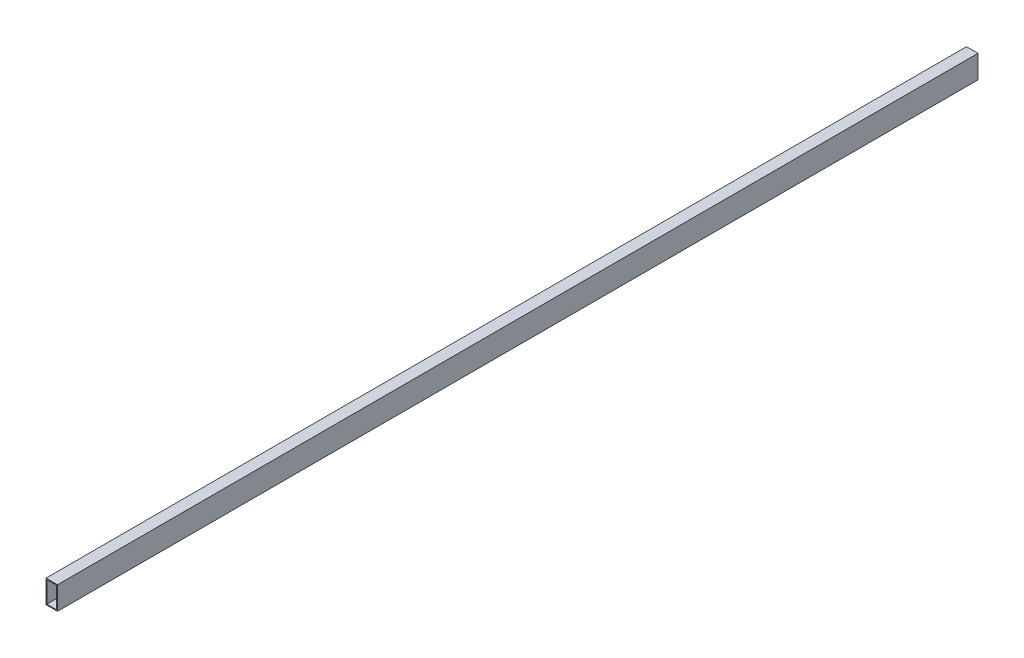
ISO-10303-21;
HEADER;
FILE_DESCRIPTION(('STEP AP214'),'2;1');
FILE_NAME('part.step','',(''),(''),'','','');
FILE_SCHEMA(('AUTOMOTIVE_DESIGN { 1 0 10303 214 1 1 1 1 }'));
ENDSEC;
DATA;
#1=APPLICATION_CONTEXT('core data for automotive mechanical design processes');
#2=APPLICATION_PROTOCOL_DEFINITION('international standard','automotive_design',2000,#1);
#3=PRODUCT_CONTEXT('',#1,'mechanical');
#4=PRODUCT('Part','Part','',(#3));
#5=PRODUCT_RELATED_PRODUCT_CATEGORY('part','',(#4));
#6=PRODUCT_DEFINITION_FORMATION('','',#4);
#7=PRODUCT_DEFINITION_CONTEXT('part definition',#1,'design');
#8=PRODUCT_DEFINITION('design','',#6,#7);
#9=PRODUCT_DEFINITION_SHAPE('','',#8);
#10=(LENGTH_UNIT() NAMED_UNIT(*) SI_UNIT(.MILLI.,.METRE.));
#11=(NAMED_UNIT(*) PLANE_ANGLE_UNIT() SI_UNIT($,.RADIAN.));
#12=(NAMED_UNIT(*) SI_UNIT($,.STERADIAN.) SOLID_ANGLE_UNIT());
#13=UNCERTAINTY_MEASURE_WITH_UNIT(LENGTH_MEASURE(1.E-05),#10,'distance_accuracy_value','');
#14=(GEOMETRIC_REPRESENTATION_CONTEXT(3) GLOBAL_UNCERTAINTY_ASSIGNED_CONTEXT((#13)) GLOBAL_UNIT_ASSIGNED_CONTEXT((#10,
#11,#12)) REPRESENTATION_CONTEXT('',''));
#15=CARTESIAN_POINT('',(0.,0.,0.));
#16=DIRECTION('',(0.,0.,1.));
#17=DIRECTION('',(1.,0.,0.));
#18=AXIS2_PLACEMENT_3D('',#15,#16,#17);
#19=CARTESIAN_POINT('',(0.,0.,4000.));
#20=DIRECTION('',(0.,0.,1.));
#21=DIRECTION('',(1.,0.,0.));
#22=AXIS2_PLACEMENT_3D('',#19,#20,#21);
#23=PLANE('',#22);
#24=DIRECTION('',(0.,-1.,0.));
#25=VECTOR('',#24,1.);
#26=CARTESIAN_POINT('',(-25.,-50.,4000.));
#27=LINE('',#26,#25);
#28=CARTESIAN_POINT('',(-25.,50.,4000.));
#29=VERTEX_POINT('',#28);
#30=CARTESIAN_POINT('',(-25.,-50.,4000.));
#31=VERTEX_POINT('',#30);
#32=EDGE_CURVE('E134',#29,#31,#27,.T.);
#33=ORIENTED_EDGE('',*,*,#32,.T.);
#34=DIRECTION('',(1.,0.,0.));
#35=VECTOR('',#34,1.);
#36=CARTESIAN_POINT('',(25.,-50.,4000.));
#37=LINE('',#36,#35);
#38=CARTESIAN_POINT('',(25.,-50.,4000.));
#39=VERTEX_POINT('',#38);
#40=EDGE_CURVE('E137',#31,#39,#37,.T.);
#41=ORIENTED_EDGE('',*,*,#40,.T.);
#42=DIRECTION('',(0.,1.,0.));
#43=VECTOR('',#42,1.);
#44=CARTESIAN_POINT('',(25.,-50.,4000.));
#45=LINE('',#44,#43);
#46=CARTESIAN_POINT('',(25.,50.,4000.));
#47=VERTEX_POINT('',#46);
#48=EDGE_CURVE('E140',#39,#47,#45,.T.);
#49=ORIENTED_EDGE('',*,*,#48,.T.);
#50=DIRECTION('',(-1.,0.,0.));
#51=VECTOR('',#50,1.);
#52=CARTESIAN_POINT('',(25.,50.,4000.));
#53=LINE('',#52,#51);
#54=EDGE_CURVE('E142',#47,#29,#53,.T.);
#55=ORIENTED_EDGE('',*,*,#54,.T.);
#56=EDGE_LOOP('',(#33,#41,#49,#55));
#57=FACE_BOUND('',#56,.T.);
#58=DIRECTION('',(-1.,0.,0.));
#59=VECTOR('',#58,1.);
#60=CARTESIAN_POINT('',(21.,46.,4000.));
#61=LINE('',#60,#59);
#62=CARTESIAN_POINT('',(21.,46.,4000.));
#63=VERTEX_POINT('',#62);
#64=CARTESIAN_POINT('',(-21.,46.,4000.));
#65=VERTEX_POINT('',#64);
#66=EDGE_CURVE('E106',#63,#65,#61,.T.);
#67=ORIENTED_EDGE('',*,*,#66,.F.);
#68=DIRECTION('',(0.,1.,0.));
#69=VECTOR('',#68,1.);
#70=CARTESIAN_POINT('',(21.,-46.,4000.));
#71=LINE('',#70,#69);
#72=CARTESIAN_POINT('',(21.,-46.,4000.));
#73=VERTEX_POINT('',#72);
#74=EDGE_CURVE('E98',#73,#63,#71,.T.);
#75=ORIENTED_EDGE('',*,*,#74,.F.);
#76=DIRECTION('',(1.,0.,0.));
#77=VECTOR('',#76,1.);
#78=CARTESIAN_POINT('',(21.,-46.,4000.));
#79=LINE('',#78,#77);
#80=CARTESIAN_POINT('',(-21.,-46.,4000.));
#81=VERTEX_POINT('',#80);
#82=EDGE_CURVE('E120',#81,#73,#79,.T.);
#83=ORIENTED_EDGE('',*,*,#82,.F.);
#84=DIRECTION('',(0.,-1.,0.));
#85=VECTOR('',#84,1.);
#86=CARTESIAN_POINT('',(-21.,-46.,4000.));
#87=LINE('',#86,#85);
#88=EDGE_CURVE('E118',#65,#81,#87,.T.);
#89=ORIENTED_EDGE('',*,*,#88,.F.);
#90=EDGE_LOOP('',(#67,#75,#83,#89));
#91=FACE_BOUND('',#90,.T.);
#92=ADVANCED_FACE('F33',(#57,#91),#23,.T.);
#93=CARTESIAN_POINT('',(0.,0.,0.));
#94=DIRECTION('',(0.,0.,1.));
#95=DIRECTION('',(1.,0.,0.));
#96=AXIS2_PLACEMENT_3D('',#93,#94,#95);
#97=PLANE('',#96);
#98=DIRECTION('',(0.,-1.,0.));
#99=VECTOR('',#98,1.);
#100=CARTESIAN_POINT('',(-25.,-50.,0.));
#101=LINE('',#100,#99);
#102=CARTESIAN_POINT('',(-25.,50.,0.));
#103=VERTEX_POINT('',#102);
#104=CARTESIAN_POINT('',(-25.,-50.,0.));
#105=VERTEX_POINT('',#104);
#106=EDGE_CURVE('E114',#103,#105,#101,.T.);
#107=ORIENTED_EDGE('',*,*,#106,.F.);
#108=DIRECTION('',(-1.,0.,0.));
#109=VECTOR('',#108,1.);
#110=CARTESIAN_POINT('',(25.,50.,0.));
#111=LINE('',#110,#109);
#112=CARTESIAN_POINT('',(25.,50.,0.));
#113=VERTEX_POINT('',#112);
#114=EDGE_CURVE('E138',#113,#103,#111,.T.);
#115=ORIENTED_EDGE('',*,*,#114,.F.);
#116=DIRECTION('',(0.,1.,0.));
#117=VECTOR('',#116,1.);
#118=CARTESIAN_POINT('',(25.,-50.,0.));
#119=LINE('',#118,#117);
#120=CARTESIAN_POINT('',(25.,-50.,0.));
#121=VERTEX_POINT('',#120);
#122=EDGE_CURVE('E149',#121,#113,#119,.T.);
#123=ORIENTED_EDGE('',*,*,#122,.F.);
#124=DIRECTION('',(1.,0.,0.));
#125=VECTOR('',#124,1.);
#126=CARTESIAN_POINT('',(25.,-50.,0.));
#127=LINE('',#126,#125);
#128=EDGE_CURVE('E147',#105,#121,#127,.T.);
#129=ORIENTED_EDGE('',*,*,#128,.F.);
#130=EDGE_LOOP('',(#107,#115,#123,#129));
#131=FACE_BOUND('',#130,.T.);
#132=DIRECTION('',(0.,1.,0.));
#133=VECTOR('',#132,1.);
#134=CARTESIAN_POINT('',(21.,-46.,0.));
#135=LINE('',#134,#133);
#136=CARTESIAN_POINT('',(21.,-46.,0.));
#137=VERTEX_POINT('',#136);
#138=CARTESIAN_POINT('',(21.,46.,0.));
#139=VERTEX_POINT('',#138);
#140=EDGE_CURVE('E56',#137,#139,#135,.T.);
#141=ORIENTED_EDGE('',*,*,#140,.T.);
#142=DIRECTION('',(-1.,0.,0.));
#143=VECTOR('',#142,1.);
#144=CARTESIAN_POINT('',(21.,46.,0.));
#145=LINE('',#144,#143);
#146=CARTESIAN_POINT('',(-21.,46.,0.));
#147=VERTEX_POINT('',#146);
#148=EDGE_CURVE('E113',#139,#147,#145,.T.);
#149=ORIENTED_EDGE('',*,*,#148,.T.);
#150=DIRECTION('',(0.,-1.,0.));
#151=VECTOR('',#150,1.);
#152=CARTESIAN_POINT('',(-21.,-46.,0.));
#153=LINE('',#152,#151);
#154=CARTESIAN_POINT('',(-21.,-46.,0.));
#155=VERTEX_POINT('',#154);
#156=EDGE_CURVE('E126',#147,#155,#153,.T.);
#157=ORIENTED_EDGE('',*,*,#156,.T.);
#158=DIRECTION('',(1.,0.,0.));
#159=VECTOR('',#158,1.);
#160=CARTESIAN_POINT('',(21.,-46.,0.));
#161=LINE('',#160,#159);
#162=EDGE_CURVE('E107',#155,#137,#161,.T.);
#163=ORIENTED_EDGE('',*,*,#162,.T.);
#164=EDGE_LOOP('',(#141,#149,#157,#163));
#165=FACE_BOUND('',#164,.T.);
#166=ADVANCED_FACE('F167',(#131,#165),#97,.F.);
#167=CARTESIAN_POINT('',(-25.,-50.,4000.));
#168=DIRECTION('',(1.,0.,0.));
#169=DIRECTION('',(0.,0.,-1.));
#170=AXIS2_PLACEMENT_3D('',#167,#168,#169);
#171=PLANE('',#170);
#172=ORIENTED_EDGE('',*,*,#106,.T.);
#173=DIRECTION('',(0.,0.,-1.));
#174=VECTOR('',#173,1.);
#175=CARTESIAN_POINT('',(-25.,-50.,4000.));
#176=LINE('',#175,#174);
#177=EDGE_CURVE('E11',#31,#105,#176,.T.);
#178=ORIENTED_EDGE('',*,*,#177,.F.);
#179=ORIENTED_EDGE('',*,*,#32,.F.);
#180=DIRECTION('',(0.,0.,-1.));
#181=VECTOR('',#180,1.);
#182=CARTESIAN_POINT('',(-25.,50.,4000.));
#183=LINE('',#182,#181);
#184=EDGE_CURVE('E144',#29,#103,#183,.T.);
#185=ORIENTED_EDGE('',*,*,#184,.T.);
#186=EDGE_LOOP('',(#172,#178,#179,#185));
#187=FACE_BOUND('',#186,.T.);
#188=ADVANCED_FACE('F35',(#187),#171,.F.);
#189=CARTESIAN_POINT('',(25.,-50.,4000.));
#190=DIRECTION('',(0.,1.,0.));
#191=DIRECTION('',(0.,0.,1.));
#192=AXIS2_PLACEMENT_3D('',#189,#190,#191);
#193=PLANE('',#192);
#194=ORIENTED_EDGE('',*,*,#128,.T.);
#195=DIRECTION('',(0.,0.,-1.));
#196=VECTOR('',#195,1.);
#197=CARTESIAN_POINT('',(25.,-50.,4000.));
#198=LINE('',#197,#196);
#199=EDGE_CURVE('E41',#39,#121,#198,.T.);
#200=ORIENTED_EDGE('',*,*,#199,.F.);
#201=ORIENTED_EDGE('',*,*,#40,.F.);
#202=ORIENTED_EDGE('',*,*,#177,.T.);
#203=EDGE_LOOP('',(#194,#200,#201,#202));
#204=FACE_BOUND('',#203,.T.);
#205=ADVANCED_FACE('F177',(#204),#193,.F.);
#206=CARTESIAN_POINT('',(25.,-50.,4000.));
#207=DIRECTION('',(-1.,0.,0.));
#208=DIRECTION('',(0.,0.,1.));
#209=AXIS2_PLACEMENT_3D('',#206,#207,#208);
#210=PLANE('',#209);
#211=ORIENTED_EDGE('',*,*,#122,.T.);
#212=DIRECTION('',(0.,0.,-1.));
#213=VECTOR('',#212,1.);
#214=CARTESIAN_POINT('',(25.,50.,4000.));
#215=LINE('',#214,#213);
#216=EDGE_CURVE('E154',#47,#113,#215,.T.);
#217=ORIENTED_EDGE('',*,*,#216,.F.);
#218=ORIENTED_EDGE('',*,*,#48,.F.);
#219=ORIENTED_EDGE('',*,*,#199,.T.);
#220=EDGE_LOOP('',(#211,#217,#218,#219));
#221=FACE_BOUND('',#220,.T.);
#222=ADVANCED_FACE('F161',(#221),#210,.F.);
#223=CARTESIAN_POINT('',(25.,50.,4000.));
#224=DIRECTION('',(0.,-1.,0.));
#225=DIRECTION('',(0.,0.,-1.));
#226=AXIS2_PLACEMENT_3D('',#223,#224,#225);
#227=PLANE('',#226);
#228=ORIENTED_EDGE('',*,*,#114,.T.);
#229=ORIENTED_EDGE('',*,*,#184,.F.);
#230=ORIENTED_EDGE('',*,*,#54,.F.);
#231=ORIENTED_EDGE('',*,*,#216,.T.);
#232=EDGE_LOOP('',(#228,#229,#230,#231));
#233=FACE_BOUND('',#232,.T.);
#234=ADVANCED_FACE('F171',(#233),#227,.F.);
#235=CARTESIAN_POINT('',(21.,-46.,4000.));
#236=DIRECTION('',(-1.,0.,0.));
#237=DIRECTION('',(0.,0.,1.));
#238=AXIS2_PLACEMENT_3D('',#235,#236,#237);
#239=PLANE('',#238);
#240=ORIENTED_EDGE('',*,*,#140,.F.);
#241=DIRECTION('',(0.,0.,-1.));
#242=VECTOR('',#241,1.);
#243=CARTESIAN_POINT('',(21.,-46.,4000.));
#244=LINE('',#243,#242);
#245=EDGE_CURVE('E102',#73,#137,#244,.T.);
#246=ORIENTED_EDGE('',*,*,#245,.F.);
#247=ORIENTED_EDGE('',*,*,#74,.T.);
#248=DIRECTION('',(0.,0.,-1.));
#249=VECTOR('',#248,1.);
#250=CARTESIAN_POINT('',(21.,46.,4000.));
#251=LINE('',#250,#249);
#252=EDGE_CURVE('E101',#63,#139,#251,.T.);
#253=ORIENTED_EDGE('',*,*,#252,.T.);
#254=EDGE_LOOP('',(#240,#246,#247,#253));
#255=FACE_BOUND('',#254,.T.);
#256=ADVANCED_FACE('F100',(#255),#239,.T.);
#257=CARTESIAN_POINT('',(21.,46.,4000.));
#258=DIRECTION('',(0.,-1.,0.));
#259=DIRECTION('',(0.,0.,-1.));
#260=AXIS2_PLACEMENT_3D('',#257,#258,#259);
#261=PLANE('',#260);
#262=ORIENTED_EDGE('',*,*,#148,.F.);
#263=ORIENTED_EDGE('',*,*,#252,.F.);
#264=ORIENTED_EDGE('',*,*,#66,.T.);
#265=DIRECTION('',(0.,0.,-1.));
#266=VECTOR('',#265,1.);
#267=CARTESIAN_POINT('',(-21.,46.,4000.));
#268=LINE('',#267,#266);
#269=EDGE_CURVE('E115',#65,#147,#268,.T.);
#270=ORIENTED_EDGE('',*,*,#269,.T.);
#271=EDGE_LOOP('',(#262,#263,#264,#270));
#272=FACE_BOUND('',#271,.T.);
#273=ADVANCED_FACE('F110',(#272),#261,.T.);
#274=CARTESIAN_POINT('',(-21.,-46.,4000.));
#275=DIRECTION('',(1.,0.,0.));
#276=DIRECTION('',(0.,1.,0.));
#277=AXIS2_PLACEMENT_3D('',#274,#275,#276);
#278=PLANE('',#277);
#279=ORIENTED_EDGE('',*,*,#156,.F.);
#280=ORIENTED_EDGE('',*,*,#269,.F.);
#281=ORIENTED_EDGE('',*,*,#88,.T.);
#282=DIRECTION('',(0.,0.,-1.));
#283=VECTOR('',#282,1.);
#284=CARTESIAN_POINT('',(-21.,-46.,4000.));
#285=LINE('',#284,#283);
#286=EDGE_CURVE('E48',#81,#155,#285,.T.);
#287=ORIENTED_EDGE('',*,*,#286,.T.);
#288=EDGE_LOOP('',(#279,#280,#281,#287));
#289=FACE_BOUND('',#288,.T.);
#290=ADVANCED_FACE('F200',(#289),#278,.T.);
#291=CARTESIAN_POINT('',(21.,-46.,4000.));
#292=DIRECTION('',(0.,1.,0.));
#293=DIRECTION('',(0.,0.,1.));
#294=AXIS2_PLACEMENT_3D('',#291,#292,#293);
#295=PLANE('',#294);
#296=ORIENTED_EDGE('',*,*,#162,.F.);
#297=ORIENTED_EDGE('',*,*,#286,.F.);
#298=ORIENTED_EDGE('',*,*,#82,.T.);
#299=ORIENTED_EDGE('',*,*,#245,.T.);
#300=EDGE_LOOP('',(#296,#297,#298,#299));
#301=FACE_BOUND('',#300,.T.);
#302=ADVANCED_FACE('F204',(#301),#295,.T.);
#303=CLOSED_SHELL('',(#92,#166,#188,#205,#222,#234,#256,#273,#290,#302));
#304=MANIFOLD_SOLID_BREP('B2',#303);
#305=ADVANCED_BREP_SHAPE_REPRESENTATION('',(#18,#304),#14);
#306=SHAPE_DEFINITION_REPRESENTATION(#9,#305);
ENDSEC;
END-ISO-10303-21;
